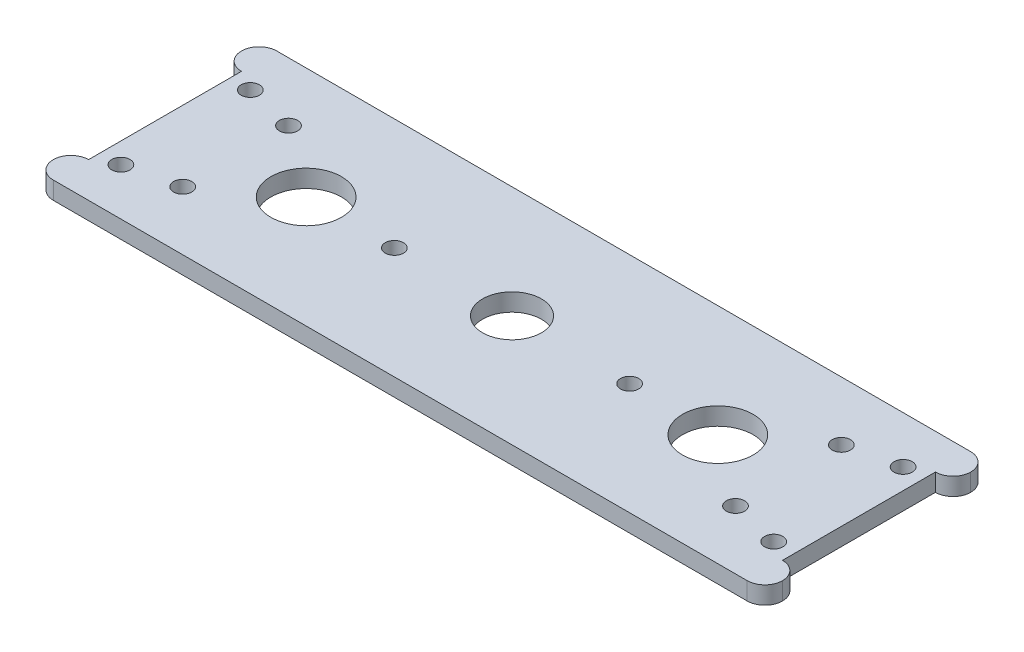
ISO-10303-21;
HEADER;
FILE_DESCRIPTION(('STEP AP214'),'2;1');
FILE_NAME('part.step','',(''),(''),'','','');
FILE_SCHEMA(('AUTOMOTIVE_DESIGN { 1 0 10303 214 1 1 1 1 }'));
ENDSEC;
DATA;
#1=APPLICATION_CONTEXT('core data for automotive mechanical design processes');
#2=APPLICATION_PROTOCOL_DEFINITION('international standard','automotive_design',2000,#1);
#3=PRODUCT_CONTEXT('',#1,'mechanical');
#4=PRODUCT('Part','Part','',(#3));
#5=PRODUCT_RELATED_PRODUCT_CATEGORY('part','',(#4));
#6=PRODUCT_DEFINITION_FORMATION('','',#4);
#7=PRODUCT_DEFINITION_CONTEXT('part definition',#1,'design');
#8=PRODUCT_DEFINITION('design','',#6,#7);
#9=PRODUCT_DEFINITION_SHAPE('','',#8);
#10=(LENGTH_UNIT() NAMED_UNIT(*) SI_UNIT(.MILLI.,.METRE.));
#11=(NAMED_UNIT(*) PLANE_ANGLE_UNIT() SI_UNIT($,.RADIAN.));
#12=(NAMED_UNIT(*) SI_UNIT($,.STERADIAN.) SOLID_ANGLE_UNIT());
#13=UNCERTAINTY_MEASURE_WITH_UNIT(LENGTH_MEASURE(1.E-05),#10,'distance_accuracy_value','');
#14=(GEOMETRIC_REPRESENTATION_CONTEXT(3) GLOBAL_UNCERTAINTY_ASSIGNED_CONTEXT((#13)) GLOBAL_UNIT_ASSIGNED_CONTEXT((#10,
#11,#12)) REPRESENTATION_CONTEXT('',''));
#15=CARTESIAN_POINT('',(0.,0.,0.));
#16=DIRECTION('',(0.,0.,1.));
#17=DIRECTION('',(1.,0.,0.));
#18=AXIS2_PLACEMENT_3D('',#15,#16,#17);
#19=CARTESIAN_POINT('',(0.,3.,0.));
#20=DIRECTION('',(0.,-1.,0.));
#21=DIRECTION('',(0.,0.,-1.));
#22=AXIS2_PLACEMENT_3D('',#19,#20,#21);
#23=PLANE('',#22);
#24=DIRECTION('',(-1.,0.,0.));
#25=VECTOR('',#24,1.);
#26=CARTESIAN_POINT('',(-62.,3.,-19.));
#27=LINE('',#26,#25);
#28=CARTESIAN_POINT('',(59.,3.,-19.));
#29=VERTEX_POINT('',#28);
#30=CARTESIAN_POINT('',(-59.,3.,-19.));
#31=VERTEX_POINT('',#30);
#32=EDGE_CURVE('E145',#29,#31,#27,.T.);
#33=ORIENTED_EDGE('',*,*,#32,.T.);
#34=CARTESIAN_POINT('',(-59.,3.,-16.));
#35=DIRECTION('',(0.,-1.,0.));
#36=DIRECTION('',(0.,0.,-1.));
#37=AXIS2_PLACEMENT_3D('',#34,#35,#36);
#38=CIRCLE('',#37,3.);
#39=CARTESIAN_POINT('',(-62.,3.,-16.));
#40=VERTEX_POINT('',#39);
#41=EDGE_CURVE('E130',#31,#40,#38,.F.);
#42=ORIENTED_EDGE('',*,*,#41,.T.);
#43=CARTESIAN_POINT('',(-59.,3.,-16.));
#44=DIRECTION('',(0.,-1.,0.));
#45=DIRECTION('',(0.,0.,-1.));
#46=AXIS2_PLACEMENT_3D('',#43,#44,#45);
#47=CIRCLE('',#46,3.);
#48=CARTESIAN_POINT('',(-59.,3.,-13.));
#49=VERTEX_POINT('',#48);
#50=EDGE_CURVE('E124',#40,#49,#47,.F.);
#51=ORIENTED_EDGE('',*,*,#50,.T.);
#52=DIRECTION('',(0.,0.,1.));
#53=VECTOR('',#52,1.);
#54=CARTESIAN_POINT('',(-59.,3.,-13.));
#55=LINE('',#54,#53);
#56=CARTESIAN_POINT('',(-59.,3.,13.));
#57=VERTEX_POINT('',#56);
#58=EDGE_CURVE('E128',#49,#57,#55,.T.);
#59=ORIENTED_EDGE('',*,*,#58,.T.);
#60=CARTESIAN_POINT('',(-59.,3.,16.));
#61=DIRECTION('',(0.,-1.,0.));
#62=DIRECTION('',(0.,0.,-1.));
#63=AXIS2_PLACEMENT_3D('',#60,#61,#62);
#64=CIRCLE('',#63,3.);
#65=CARTESIAN_POINT('',(-62.,3.,16.));
#66=VERTEX_POINT('',#65);
#67=EDGE_CURVE('E135',#57,#66,#64,.F.);
#68=ORIENTED_EDGE('',*,*,#67,.T.);
#69=CARTESIAN_POINT('',(-59.,3.,16.));
#70=DIRECTION('',(0.,-1.,0.));
#71=DIRECTION('',(0.,0.,-1.));
#72=AXIS2_PLACEMENT_3D('',#69,#70,#71);
#73=CIRCLE('',#72,3.);
#74=CARTESIAN_POINT('',(-59.,3.,19.));
#75=VERTEX_POINT('',#74);
#76=EDGE_CURVE('E182',#66,#75,#73,.F.);
#77=ORIENTED_EDGE('',*,*,#76,.T.);
#78=DIRECTION('',(1.,0.,0.));
#79=VECTOR('',#78,1.);
#80=CARTESIAN_POINT('',(-62.,3.,19.));
#81=LINE('',#80,#79);
#82=CARTESIAN_POINT('',(59.,3.,19.));
#83=VERTEX_POINT('',#82);
#84=EDGE_CURVE('E144',#75,#83,#81,.T.);
#85=ORIENTED_EDGE('',*,*,#84,.T.);
#86=CARTESIAN_POINT('',(59.,3.,16.));
#87=DIRECTION('',(0.,-1.,0.));
#88=DIRECTION('',(0.,0.,-1.));
#89=AXIS2_PLACEMENT_3D('',#86,#87,#88);
#90=CIRCLE('',#89,3.);
#91=CARTESIAN_POINT('',(62.,3.,16.));
#92=VERTEX_POINT('',#91);
#93=EDGE_CURVE('E52',#83,#92,#90,.F.);
#94=ORIENTED_EDGE('',*,*,#93,.T.);
#95=CARTESIAN_POINT('',(59.,3.,16.));
#96=DIRECTION('',(0.,-1.,0.));
#97=DIRECTION('',(0.,0.,-1.));
#98=AXIS2_PLACEMENT_3D('',#95,#96,#97);
#99=CIRCLE('',#98,3.);
#100=CARTESIAN_POINT('',(59.,3.,13.));
#101=VERTEX_POINT('',#100);
#102=EDGE_CURVE('E179',#92,#101,#99,.F.);
#103=ORIENTED_EDGE('',*,*,#102,.T.);
#104=DIRECTION('',(0.,0.,-1.));
#105=VECTOR('',#104,1.);
#106=CARTESIAN_POINT('',(59.,3.,-13.));
#107=LINE('',#106,#105);
#108=CARTESIAN_POINT('',(59.,3.,-13.));
#109=VERTEX_POINT('',#108);
#110=EDGE_CURVE('E222',#101,#109,#107,.T.);
#111=ORIENTED_EDGE('',*,*,#110,.T.);
#112=CARTESIAN_POINT('',(59.,3.,-16.));
#113=DIRECTION('',(0.,-1.,0.));
#114=DIRECTION('',(0.,0.,-1.));
#115=AXIS2_PLACEMENT_3D('',#112,#113,#114);
#116=CIRCLE('',#115,3.);
#117=CARTESIAN_POINT('',(62.,3.,-16.));
#118=VERTEX_POINT('',#117);
#119=EDGE_CURVE('E177',#109,#118,#116,.F.);
#120=ORIENTED_EDGE('',*,*,#119,.T.);
#121=CARTESIAN_POINT('',(59.,3.,-16.));
#122=DIRECTION('',(0.,-1.,0.));
#123=DIRECTION('',(0.,0.,-1.));
#124=AXIS2_PLACEMENT_3D('',#121,#122,#123);
#125=CIRCLE('',#124,3.);
#126=EDGE_CURVE('E175',#118,#29,#125,.F.);
#127=ORIENTED_EDGE('',*,*,#126,.T.);
#128=EDGE_LOOP('',(#33,#42,#51,#59,#68,#77,#85,#94,#103,#111,#120,#127));
#129=FACE_BOUND('',#128,.T.);
#130=CARTESIAN_POINT('',(0.,3.,0.));
#131=DIRECTION('',(0.,1.,0.));
#132=DIRECTION('',(0.,0.,1.));
#133=AXIS2_PLACEMENT_3D('',#130,#131,#132);
#134=CIRCLE('',#133,5.);
#135=CARTESIAN_POINT('',(0.,3.,5.));
#136=VERTEX_POINT('',#135);
#137=EDGE_CURVE('E228',#136,#136,#134,.T.);
#138=ORIENTED_EDGE('',*,*,#137,.F.);
#139=EDGE_LOOP('',(#138));
#140=FACE_BOUND('',#139,.T.);
#141=CARTESIAN_POINT('',(55.5,3.,-11.));
#142=DIRECTION('',(0.,1.,0.));
#143=DIRECTION('',(0.,0.,1.));
#144=AXIS2_PLACEMENT_3D('',#141,#142,#143);
#145=CIRCLE('',#144,1.54999999999999);
#146=CARTESIAN_POINT('',(55.5,3.,-9.45));
#147=VERTEX_POINT('',#146);
#148=EDGE_CURVE('E350',#147,#147,#145,.T.);
#149=ORIENTED_EDGE('',*,*,#148,.F.);
#150=EDGE_LOOP('',(#149));
#151=FACE_BOUND('',#150,.T.);
#152=CARTESIAN_POINT('',(-55.5,3.,-11.));
#153=DIRECTION('',(0.,1.,0.));
#154=DIRECTION('',(0.,0.,-1.));
#155=AXIS2_PLACEMENT_3D('',#152,#153,#154);
#156=CIRCLE('',#155,1.54999999999999);
#157=CARTESIAN_POINT('',(-55.5,3.,-12.55));
#158=VERTEX_POINT('',#157);
#159=EDGE_CURVE('E355',#158,#158,#156,.T.);
#160=ORIENTED_EDGE('',*,*,#159,.F.);
#161=EDGE_LOOP('',(#160));
#162=FACE_BOUND('',#161,.T.);
#163=CARTESIAN_POINT('',(-55.5,3.,11.));
#164=DIRECTION('',(0.,1.,0.));
#165=DIRECTION('',(0.,0.,1.));
#166=AXIS2_PLACEMENT_3D('',#163,#164,#165);
#167=CIRCLE('',#166,1.54999999999999);
#168=CARTESIAN_POINT('',(-55.5,3.,12.55));
#169=VERTEX_POINT('',#168);
#170=EDGE_CURVE('E434',#169,#169,#167,.T.);
#171=ORIENTED_EDGE('',*,*,#170,.F.);
#172=EDGE_LOOP('',(#171));
#173=FACE_BOUND('',#172,.T.);
#174=CARTESIAN_POINT('',(55.5,3.,11.));
#175=DIRECTION('',(0.,1.,0.));
#176=DIRECTION('',(0.,0.,-1.));
#177=AXIS2_PLACEMENT_3D('',#174,#175,#176);
#178=CIRCLE('',#177,1.54999999999999);
#179=CARTESIAN_POINT('',(55.5,3.,9.45));
#180=VERTEX_POINT('',#179);
#181=EDGE_CURVE('E429',#180,#180,#178,.T.);
#182=ORIENTED_EDGE('',*,*,#181,.F.);
#183=EDGE_LOOP('',(#182));
#184=FACE_BOUND('',#183,.T.);
#185=CARTESIAN_POINT('',(20.,3.,0.));
#186=DIRECTION('',(0.,1.,0.));
#187=DIRECTION('',(0.,0.,1.));
#188=AXIS2_PLACEMENT_3D('',#185,#186,#187);
#189=CIRCLE('',#188,1.55);
#190=CARTESIAN_POINT('',(20.,3.,1.55));
#191=VERTEX_POINT('',#190);
#192=EDGE_CURVE('E424',#191,#191,#189,.T.);
#193=ORIENTED_EDGE('',*,*,#192,.F.);
#194=EDGE_LOOP('',(#193));
#195=FACE_BOUND('',#194,.T.);
#196=CARTESIAN_POINT('',(-20.,3.,0.));
#197=DIRECTION('',(0.,1.,0.));
#198=DIRECTION('',(0.,0.,-1.));
#199=AXIS2_PLACEMENT_3D('',#196,#197,#198);
#200=CIRCLE('',#199,1.55);
#201=CARTESIAN_POINT('',(-20.,3.,-1.55));
#202=VERTEX_POINT('',#201);
#203=EDGE_CURVE('E419',#202,#202,#200,.T.);
#204=ORIENTED_EDGE('',*,*,#203,.F.);
#205=EDGE_LOOP('',(#204));
#206=FACE_BOUND('',#205,.T.);
#207=CARTESIAN_POINT('',(35.,3.,0.));
#208=DIRECTION('',(0.,1.,0.));
#209=DIRECTION('',(0.,0.,1.));
#210=AXIS2_PLACEMENT_3D('',#207,#208,#209);
#211=CIRCLE('',#210,6.);
#212=CARTESIAN_POINT('',(35.,3.,6.));
#213=VERTEX_POINT('',#212);
#214=EDGE_CURVE('E414',#213,#213,#211,.T.);
#215=ORIENTED_EDGE('',*,*,#214,.F.);
#216=EDGE_LOOP('',(#215));
#217=FACE_BOUND('',#216,.T.);
#218=CARTESIAN_POINT('',(-35.,3.,0.));
#219=DIRECTION('',(0.,1.,0.));
#220=DIRECTION('',(0.,0.,-1.));
#221=AXIS2_PLACEMENT_3D('',#218,#219,#220);
#222=CIRCLE('',#221,6.);
#223=CARTESIAN_POINT('',(-35.,3.,-6.));
#224=VERTEX_POINT('',#223);
#225=EDGE_CURVE('E409',#224,#224,#222,.T.);
#226=ORIENTED_EDGE('',*,*,#225,.F.);
#227=EDGE_LOOP('',(#226));
#228=FACE_BOUND('',#227,.T.);
#229=CARTESIAN_POINT('',(47.,3.,-9.));
#230=DIRECTION('',(0.,1.,0.));
#231=DIRECTION('',(0.,0.,1.));
#232=AXIS2_PLACEMENT_3D('',#229,#230,#231);
#233=CIRCLE('',#232,1.55);
#234=CARTESIAN_POINT('',(47.,3.,-7.45));
#235=VERTEX_POINT('',#234);
#236=EDGE_CURVE('E404',#235,#235,#233,.T.);
#237=ORIENTED_EDGE('',*,*,#236,.F.);
#238=EDGE_LOOP('',(#237));
#239=FACE_BOUND('',#238,.T.);
#240=CARTESIAN_POINT('',(47.,3.,9.));
#241=DIRECTION('',(0.,1.,0.));
#242=DIRECTION('',(0.,0.,-1.));
#243=AXIS2_PLACEMENT_3D('',#240,#241,#242);
#244=CIRCLE('',#243,1.55);
#245=CARTESIAN_POINT('',(47.,3.,7.45));
#246=VERTEX_POINT('',#245);
#247=EDGE_CURVE('E399',#246,#246,#244,.T.);
#248=ORIENTED_EDGE('',*,*,#247,.F.);
#249=EDGE_LOOP('',(#248));
#250=FACE_BOUND('',#249,.T.);
#251=CARTESIAN_POINT('',(-47.,3.,9.));
#252=DIRECTION('',(0.,1.,0.));
#253=DIRECTION('',(0.,0.,1.));
#254=AXIS2_PLACEMENT_3D('',#251,#252,#253);
#255=CIRCLE('',#254,1.55);
#256=CARTESIAN_POINT('',(-47.,3.,10.55));
#257=VERTEX_POINT('',#256);
#258=EDGE_CURVE('E394',#257,#257,#255,.T.);
#259=ORIENTED_EDGE('',*,*,#258,.F.);
#260=EDGE_LOOP('',(#259));
#261=FACE_BOUND('',#260,.T.);
#262=CARTESIAN_POINT('',(-47.,3.,-9.));
#263=DIRECTION('',(0.,1.,0.));
#264=DIRECTION('',(0.,0.,-1.));
#265=AXIS2_PLACEMENT_3D('',#262,#263,#264);
#266=CIRCLE('',#265,1.55);
#267=CARTESIAN_POINT('',(-47.,3.,-10.55));
#268=VERTEX_POINT('',#267);
#269=EDGE_CURVE('E389',#268,#268,#266,.T.);
#270=ORIENTED_EDGE('',*,*,#269,.F.);
#271=EDGE_LOOP('',(#270));
#272=FACE_BOUND('',#271,.T.);
#273=ADVANCED_FACE('F35',(#129,#140,#151,#162,#173,#184,#195,#206,#217,#228,#239,#250,#261,
#272),#23,.F.);
#274=CARTESIAN_POINT('',(0.,0.,0.));
#275=DIRECTION('',(0.,-1.,0.));
#276=DIRECTION('',(0.,0.,-1.));
#277=AXIS2_PLACEMENT_3D('',#274,#275,#276);
#278=PLANE('',#277);
#279=CARTESIAN_POINT('',(-47.,0.,9.));
#280=DIRECTION('',(0.,1.,0.));
#281=DIRECTION('',(0.,0.,1.));
#282=AXIS2_PLACEMENT_3D('',#279,#280,#281);
#283=CIRCLE('',#282,1.55);
#284=CARTESIAN_POINT('',(-47.,0.,10.55));
#285=VERTEX_POINT('',#284);
#286=EDGE_CURVE('E391',#285,#285,#283,.T.);
#287=ORIENTED_EDGE('',*,*,#286,.T.);
#288=EDGE_LOOP('',(#287));
#289=FACE_BOUND('',#288,.T.);
#290=CARTESIAN_POINT('',(47.,0.,-9.));
#291=DIRECTION('',(0.,1.,0.));
#292=DIRECTION('',(0.,0.,1.));
#293=AXIS2_PLACEMENT_3D('',#290,#291,#292);
#294=CIRCLE('',#293,1.55);
#295=CARTESIAN_POINT('',(47.,0.,-7.45));
#296=VERTEX_POINT('',#295);
#297=EDGE_CURVE('E402',#296,#296,#294,.T.);
#298=ORIENTED_EDGE('',*,*,#297,.T.);
#299=EDGE_LOOP('',(#298));
#300=FACE_BOUND('',#299,.T.);
#301=CARTESIAN_POINT('',(35.,0.,0.));
#302=DIRECTION('',(0.,1.,0.));
#303=DIRECTION('',(0.,0.,1.));
#304=AXIS2_PLACEMENT_3D('',#301,#302,#303);
#305=CIRCLE('',#304,6.);
#306=CARTESIAN_POINT('',(35.,0.,6.));
#307=VERTEX_POINT('',#306);
#308=EDGE_CURVE('E412',#307,#307,#305,.T.);
#309=ORIENTED_EDGE('',*,*,#308,.T.);
#310=EDGE_LOOP('',(#309));
#311=FACE_BOUND('',#310,.T.);
#312=CARTESIAN_POINT('',(20.,0.,0.));
#313=DIRECTION('',(0.,1.,0.));
#314=DIRECTION('',(0.,0.,1.));
#315=AXIS2_PLACEMENT_3D('',#312,#313,#314);
#316=CIRCLE('',#315,1.55);
#317=CARTESIAN_POINT('',(20.,0.,1.55));
#318=VERTEX_POINT('',#317);
#319=EDGE_CURVE('E422',#318,#318,#316,.T.);
#320=ORIENTED_EDGE('',*,*,#319,.T.);
#321=EDGE_LOOP('',(#320));
#322=FACE_BOUND('',#321,.T.);
#323=CARTESIAN_POINT('',(-55.5,0.,11.));
#324=DIRECTION('',(0.,1.,0.));
#325=DIRECTION('',(0.,0.,1.));
#326=AXIS2_PLACEMENT_3D('',#323,#324,#325);
#327=CIRCLE('',#326,1.54999999999999);
#328=CARTESIAN_POINT('',(-55.5,0.,12.55));
#329=VERTEX_POINT('',#328);
#330=EDGE_CURVE('E432',#329,#329,#327,.T.);
#331=ORIENTED_EDGE('',*,*,#330,.T.);
#332=EDGE_LOOP('',(#331));
#333=FACE_BOUND('',#332,.T.);
#334=CARTESIAN_POINT('',(55.5,0.,-11.));
#335=DIRECTION('',(0.,1.,0.));
#336=DIRECTION('',(0.,0.,1.));
#337=AXIS2_PLACEMENT_3D('',#334,#335,#336);
#338=CIRCLE('',#337,1.54999999999999);
#339=CARTESIAN_POINT('',(55.5,0.,-9.45));
#340=VERTEX_POINT('',#339);
#341=EDGE_CURVE('E353',#340,#340,#338,.T.);
#342=ORIENTED_EDGE('',*,*,#341,.T.);
#343=EDGE_LOOP('',(#342));
#344=FACE_BOUND('',#343,.T.);
#345=CARTESIAN_POINT('',(-59.,0.,-16.));
#346=DIRECTION('',(0.,-1.,0.));
#347=DIRECTION('',(0.,0.,-1.));
#348=AXIS2_PLACEMENT_3D('',#345,#346,#347);
#349=CIRCLE('',#348,3.);
#350=CARTESIAN_POINT('',(-59.,0.,-13.));
#351=VERTEX_POINT('',#350);
#352=CARTESIAN_POINT('',(-62.,0.,-16.));
#353=VERTEX_POINT('',#352);
#354=EDGE_CURVE('E149',#351,#353,#349,.T.);
#355=ORIENTED_EDGE('',*,*,#354,.T.);
#356=CARTESIAN_POINT('',(-59.,0.,-16.));
#357=DIRECTION('',(0.,-1.,0.));
#358=DIRECTION('',(0.,0.,-1.));
#359=AXIS2_PLACEMENT_3D('',#356,#357,#358);
#360=CIRCLE('',#359,3.);
#361=CARTESIAN_POINT('',(-59.,0.,-19.));
#362=VERTEX_POINT('',#361);
#363=EDGE_CURVE('E168',#353,#362,#360,.T.);
#364=ORIENTED_EDGE('',*,*,#363,.T.);
#365=DIRECTION('',(-1.,0.,0.));
#366=VECTOR('',#365,1.);
#367=CARTESIAN_POINT('',(-62.,0.,-19.));
#368=LINE('',#367,#366);
#369=CARTESIAN_POINT('',(59.,0.,-19.));
#370=VERTEX_POINT('',#369);
#371=EDGE_CURVE('E225',#370,#362,#368,.T.);
#372=ORIENTED_EDGE('',*,*,#371,.F.);
#373=CARTESIAN_POINT('',(59.,0.,-16.));
#374=DIRECTION('',(0.,-1.,0.));
#375=DIRECTION('',(0.,0.,-1.));
#376=AXIS2_PLACEMENT_3D('',#373,#374,#375);
#377=CIRCLE('',#376,3.);
#378=CARTESIAN_POINT('',(62.,0.,-16.));
#379=VERTEX_POINT('',#378);
#380=EDGE_CURVE('E150',#370,#379,#377,.T.);
#381=ORIENTED_EDGE('',*,*,#380,.T.);
#382=CARTESIAN_POINT('',(59.,0.,-16.));
#383=DIRECTION('',(0.,-1.,0.));
#384=DIRECTION('',(0.,0.,-1.));
#385=AXIS2_PLACEMENT_3D('',#382,#383,#384);
#386=CIRCLE('',#385,3.);
#387=CARTESIAN_POINT('',(59.,0.,-13.));
#388=VERTEX_POINT('',#387);
#389=EDGE_CURVE('E152',#379,#388,#386,.T.);
#390=ORIENTED_EDGE('',*,*,#389,.T.);
#391=DIRECTION('',(0.,0.,-1.));
#392=VECTOR('',#391,1.);
#393=CARTESIAN_POINT('',(59.,0.,-13.));
#394=LINE('',#393,#392);
#395=CARTESIAN_POINT('',(59.,0.,13.));
#396=VERTEX_POINT('',#395);
#397=EDGE_CURVE('E212',#396,#388,#394,.T.);
#398=ORIENTED_EDGE('',*,*,#397,.F.);
#399=CARTESIAN_POINT('',(59.,0.,16.));
#400=DIRECTION('',(0.,-1.,0.));
#401=DIRECTION('',(0.,0.,-1.));
#402=AXIS2_PLACEMENT_3D('',#399,#400,#401);
#403=CIRCLE('',#402,3.);
#404=CARTESIAN_POINT('',(62.,0.,16.));
#405=VERTEX_POINT('',#404);
#406=EDGE_CURVE('E159',#396,#405,#403,.T.);
#407=ORIENTED_EDGE('',*,*,#406,.T.);
#408=CARTESIAN_POINT('',(59.,0.,16.));
#409=DIRECTION('',(0.,-1.,0.));
#410=DIRECTION('',(0.,0.,-1.));
#411=AXIS2_PLACEMENT_3D('',#408,#409,#410);
#412=CIRCLE('',#411,3.);
#413=CARTESIAN_POINT('',(59.,0.,19.));
#414=VERTEX_POINT('',#413);
#415=EDGE_CURVE('E161',#405,#414,#412,.T.);
#416=ORIENTED_EDGE('',*,*,#415,.T.);
#417=DIRECTION('',(1.,0.,0.));
#418=VECTOR('',#417,1.);
#419=CARTESIAN_POINT('',(-62.,0.,19.));
#420=LINE('',#419,#418);
#421=CARTESIAN_POINT('',(-59.,0.,19.));
#422=VERTEX_POINT('',#421);
#423=EDGE_CURVE('E215',#422,#414,#420,.T.);
#424=ORIENTED_EDGE('',*,*,#423,.F.);
#425=CARTESIAN_POINT('',(-59.,0.,16.));
#426=DIRECTION('',(0.,-1.,0.));
#427=DIRECTION('',(0.,0.,-1.));
#428=AXIS2_PLACEMENT_3D('',#425,#426,#427);
#429=CIRCLE('',#428,3.);
#430=CARTESIAN_POINT('',(-62.,0.,16.));
#431=VERTEX_POINT('',#430);
#432=EDGE_CURVE('E163',#422,#431,#429,.T.);
#433=ORIENTED_EDGE('',*,*,#432,.T.);
#434=CARTESIAN_POINT('',(-59.,0.,16.));
#435=DIRECTION('',(0.,-1.,0.));
#436=DIRECTION('',(0.,0.,-1.));
#437=AXIS2_PLACEMENT_3D('',#434,#435,#436);
#438=CIRCLE('',#437,3.);
#439=CARTESIAN_POINT('',(-59.,0.,13.));
#440=VERTEX_POINT('',#439);
#441=EDGE_CURVE('E165',#431,#440,#438,.T.);
#442=ORIENTED_EDGE('',*,*,#441,.T.);
#443=DIRECTION('',(0.,0.,1.));
#444=VECTOR('',#443,1.);
#445=CARTESIAN_POINT('',(-59.,0.,-13.));
#446=LINE('',#445,#444);
#447=EDGE_CURVE('E227',#351,#440,#446,.T.);
#448=ORIENTED_EDGE('',*,*,#447,.F.);
#449=EDGE_LOOP('',(#355,#364,#372,#381,#390,#398,#407,#416,#424,#433,#442,#448));
#450=FACE_BOUND('',#449,.T.);
#451=CARTESIAN_POINT('',(0.,0.,0.));
#452=DIRECTION('',(0.,1.,0.));
#453=DIRECTION('',(0.,0.,1.));
#454=AXIS2_PLACEMENT_3D('',#451,#452,#453);
#455=CIRCLE('',#454,5.);
#456=CARTESIAN_POINT('',(0.,0.,5.));
#457=VERTEX_POINT('',#456);
#458=EDGE_CURVE('E218',#457,#457,#455,.T.);
#459=ORIENTED_EDGE('',*,*,#458,.T.);
#460=EDGE_LOOP('',(#459));
#461=FACE_BOUND('',#460,.T.);
#462=CARTESIAN_POINT('',(-55.5,0.,-11.));
#463=DIRECTION('',(0.,1.,0.));
#464=DIRECTION('',(0.,0.,-1.));
#465=AXIS2_PLACEMENT_3D('',#462,#463,#464);
#466=CIRCLE('',#465,1.54999999999999);
#467=CARTESIAN_POINT('',(-55.5,0.,-12.55));
#468=VERTEX_POINT('',#467);
#469=EDGE_CURVE('E359',#468,#468,#466,.T.);
#470=ORIENTED_EDGE('',*,*,#469,.T.);
#471=EDGE_LOOP('',(#470));
#472=FACE_BOUND('',#471,.T.);
#473=CARTESIAN_POINT('',(55.5,0.,11.));
#474=DIRECTION('',(0.,1.,0.));
#475=DIRECTION('',(0.,0.,-1.));
#476=AXIS2_PLACEMENT_3D('',#473,#474,#475);
#477=CIRCLE('',#476,1.54999999999999);
#478=CARTESIAN_POINT('',(55.5,0.,9.45));
#479=VERTEX_POINT('',#478);
#480=EDGE_CURVE('E374',#479,#479,#477,.T.);
#481=ORIENTED_EDGE('',*,*,#480,.T.);
#482=EDGE_LOOP('',(#481));
#483=FACE_BOUND('',#482,.T.);
#484=CARTESIAN_POINT('',(-20.,0.,0.));
#485=DIRECTION('',(0.,1.,0.));
#486=DIRECTION('',(0.,0.,-1.));
#487=AXIS2_PLACEMENT_3D('',#484,#485,#486);
#488=CIRCLE('',#487,1.55);
#489=CARTESIAN_POINT('',(-20.,0.,-1.55));
#490=VERTEX_POINT('',#489);
#491=EDGE_CURVE('E378',#490,#490,#488,.T.);
#492=ORIENTED_EDGE('',*,*,#491,.T.);
#493=EDGE_LOOP('',(#492));
#494=FACE_BOUND('',#493,.T.);
#495=CARTESIAN_POINT('',(-35.,0.,0.));
#496=DIRECTION('',(0.,1.,0.));
#497=DIRECTION('',(0.,0.,-1.));
#498=AXIS2_PLACEMENT_3D('',#495,#496,#497);
#499=CIRCLE('',#498,6.);
#500=CARTESIAN_POINT('',(-35.,0.,-6.));
#501=VERTEX_POINT('',#500);
#502=EDGE_CURVE('E382',#501,#501,#499,.T.);
#503=ORIENTED_EDGE('',*,*,#502,.T.);
#504=EDGE_LOOP('',(#503));
#505=FACE_BOUND('',#504,.T.);
#506=CARTESIAN_POINT('',(47.,0.,9.));
#507=DIRECTION('',(0.,1.,0.));
#508=DIRECTION('',(0.,0.,-1.));
#509=AXIS2_PLACEMENT_3D('',#506,#507,#508);
#510=CIRCLE('',#509,1.55);
#511=CARTESIAN_POINT('',(47.,0.,7.45));
#512=VERTEX_POINT('',#511);
#513=EDGE_CURVE('E386',#512,#512,#510,.T.);
#514=ORIENTED_EDGE('',*,*,#513,.T.);
#515=EDGE_LOOP('',(#514));
#516=FACE_BOUND('',#515,.T.);
#517=CARTESIAN_POINT('',(-47.,0.,-9.));
#518=DIRECTION('',(0.,1.,0.));
#519=DIRECTION('',(0.,0.,-1.));
#520=AXIS2_PLACEMENT_3D('',#517,#518,#519);
#521=CIRCLE('',#520,1.55);
#522=CARTESIAN_POINT('',(-47.,0.,-10.55));
#523=VERTEX_POINT('',#522);
#524=EDGE_CURVE('E189',#523,#523,#521,.T.);
#525=ORIENTED_EDGE('',*,*,#524,.T.);
#526=EDGE_LOOP('',(#525));
#527=FACE_BOUND('',#526,.T.);
#528=ADVANCED_FACE('F241',(#289,#300,#311,#322,#333,#344,#450,#461,#472,#483,#494,#505,#516,
#527),#278,.T.);
#529=CARTESIAN_POINT('',(-62.,3.,-19.));
#530=DIRECTION('',(0.,0.,1.));
#531=DIRECTION('',(1.,0.,0.));
#532=AXIS2_PLACEMENT_3D('',#529,#530,#531);
#533=PLANE('',#532);
#534=ORIENTED_EDGE('',*,*,#371,.T.);
#535=DIRECTION('',(0.,-1.,0.));
#536=VECTOR('',#535,1.);
#537=CARTESIAN_POINT('',(-59.,3.,-19.));
#538=LINE('',#537,#536);
#539=EDGE_CURVE('E172',#362,#31,#538,.F.);
#540=ORIENTED_EDGE('',*,*,#539,.T.);
#541=ORIENTED_EDGE('',*,*,#32,.F.);
#542=DIRECTION('',(0.,-1.,0.));
#543=VECTOR('',#542,1.);
#544=CARTESIAN_POINT('',(59.,3.,-19.));
#545=LINE('',#544,#543);
#546=EDGE_CURVE('E170',#29,#370,#545,.T.);
#547=ORIENTED_EDGE('',*,*,#546,.T.);
#548=EDGE_LOOP('',(#534,#540,#541,#547));
#549=FACE_BOUND('',#548,.T.);
#550=ADVANCED_FACE('F209',(#549),#533,.F.);
#551=CARTESIAN_POINT('',(-59.,3.,-13.));
#552=DIRECTION('',(1.,0.,0.));
#553=DIRECTION('',(0.,0.,-1.));
#554=AXIS2_PLACEMENT_3D('',#551,#552,#553);
#555=PLANE('',#554);
#556=ORIENTED_EDGE('',*,*,#447,.T.);
#557=DIRECTION('',(0.,-1.,0.));
#558=VECTOR('',#557,1.);
#559=CARTESIAN_POINT('',(-59.,3.,13.));
#560=LINE('',#559,#558);
#561=EDGE_CURVE('E143',#57,#440,#560,.T.);
#562=ORIENTED_EDGE('',*,*,#561,.F.);
#563=ORIENTED_EDGE('',*,*,#58,.F.);
#564=DIRECTION('',(0.,-1.,0.));
#565=VECTOR('',#564,1.);
#566=CARTESIAN_POINT('',(-59.,3.,-13.));
#567=LINE('',#566,#565);
#568=EDGE_CURVE('E140',#49,#351,#567,.T.);
#569=ORIENTED_EDGE('',*,*,#568,.T.);
#570=EDGE_LOOP('',(#556,#562,#563,#569));
#571=FACE_BOUND('',#570,.T.);
#572=ADVANCED_FACE('F139',(#571),#555,.F.);
#573=CARTESIAN_POINT('',(-62.,3.,19.));
#574=DIRECTION('',(0.,0.,-1.));
#575=DIRECTION('',(-1.,0.,0.));
#576=AXIS2_PLACEMENT_3D('',#573,#574,#575);
#577=PLANE('',#576);
#578=ORIENTED_EDGE('',*,*,#84,.F.);
#579=DIRECTION('',(0.,-1.,0.));
#580=VECTOR('',#579,1.);
#581=CARTESIAN_POINT('',(-59.,3.,19.));
#582=LINE('',#581,#580);
#583=EDGE_CURVE('E11',#75,#422,#582,.T.);
#584=ORIENTED_EDGE('',*,*,#583,.T.);
#585=ORIENTED_EDGE('',*,*,#423,.T.);
#586=DIRECTION('',(0.,-1.,0.));
#587=VECTOR('',#586,1.);
#588=CARTESIAN_POINT('',(59.,3.,19.));
#589=LINE('',#588,#587);
#590=EDGE_CURVE('E44',#414,#83,#589,.F.);
#591=ORIENTED_EDGE('',*,*,#590,.T.);
#592=EDGE_LOOP('',(#578,#584,#585,#591));
#593=FACE_BOUND('',#592,.T.);
#594=ADVANCED_FACE('F249',(#593),#577,.F.);
#595=CARTESIAN_POINT('',(59.,3.,-13.));
#596=DIRECTION('',(-1.,0.,0.));
#597=DIRECTION('',(0.,0.,1.));
#598=AXIS2_PLACEMENT_3D('',#595,#596,#597);
#599=PLANE('',#598);
#600=ORIENTED_EDGE('',*,*,#397,.T.);
#601=DIRECTION('',(0.,-1.,0.));
#602=VECTOR('',#601,1.);
#603=CARTESIAN_POINT('',(59.,3.,-13.));
#604=LINE('',#603,#602);
#605=EDGE_CURVE('E224',#109,#388,#604,.T.);
#606=ORIENTED_EDGE('',*,*,#605,.F.);
#607=ORIENTED_EDGE('',*,*,#110,.F.);
#608=DIRECTION('',(0.,-1.,0.));
#609=VECTOR('',#608,1.);
#610=CARTESIAN_POINT('',(59.,3.,13.));
#611=LINE('',#610,#609);
#612=EDGE_CURVE('E154',#101,#396,#611,.T.);
#613=ORIENTED_EDGE('',*,*,#612,.T.);
#614=EDGE_LOOP('',(#600,#606,#607,#613));
#615=FACE_BOUND('',#614,.T.);
#616=ADVANCED_FACE('F236',(#615),#599,.F.);
#617=CARTESIAN_POINT('',(0.,3.,0.));
#618=DIRECTION('',(0.,-1.,0.));
#619=DIRECTION('',(0.,0.,-1.));
#620=AXIS2_PLACEMENT_3D('',#617,#618,#619);
#621=CYLINDRICAL_SURFACE('',#620,5.);
#622=ORIENTED_EDGE('',*,*,#137,.T.);
#623=EDGE_LOOP('',(#622));
#624=FACE_BOUND('',#623,.T.);
#625=ORIENTED_EDGE('',*,*,#458,.F.);
#626=EDGE_LOOP('',(#625));
#627=FACE_BOUND('',#626,.T.);
#628=ADVANCED_FACE('F276',(#624,#627),#621,.F.);
#629=CARTESIAN_POINT('',(55.5,3.,-11.));
#630=DIRECTION('',(0.,-1.,0.));
#631=DIRECTION('',(0.,0.,-1.));
#632=AXIS2_PLACEMENT_3D('',#629,#630,#631);
#633=CYLINDRICAL_SURFACE('',#632,1.54999999999999);
#634=ORIENTED_EDGE('',*,*,#148,.T.);
#635=EDGE_LOOP('',(#634));
#636=FACE_BOUND('',#635,.T.);
#637=ORIENTED_EDGE('',*,*,#341,.F.);
#638=EDGE_LOOP('',(#637));
#639=FACE_BOUND('',#638,.T.);
#640=ADVANCED_FACE('F339',(#636,#639),#633,.F.);
#641=CARTESIAN_POINT('',(-55.5,3.,-11.));
#642=DIRECTION('',(0.,-1.,0.));
#643=DIRECTION('',(0.,0.,-1.));
#644=AXIS2_PLACEMENT_3D('',#641,#642,#643);
#645=CYLINDRICAL_SURFACE('',#644,1.54999999999999);
#646=ORIENTED_EDGE('',*,*,#159,.T.);
#647=EDGE_LOOP('',(#646));
#648=FACE_BOUND('',#647,.T.);
#649=ORIENTED_EDGE('',*,*,#469,.F.);
#650=EDGE_LOOP('',(#649));
#651=FACE_BOUND('',#650,.T.);
#652=ADVANCED_FACE('F336',(#648,#651),#645,.F.);
#653=CARTESIAN_POINT('',(-55.5,3.,11.));
#654=DIRECTION('',(0.,-1.,0.));
#655=DIRECTION('',(0.,0.,-1.));
#656=AXIS2_PLACEMENT_3D('',#653,#654,#655);
#657=CYLINDRICAL_SURFACE('',#656,1.54999999999999);
#658=ORIENTED_EDGE('',*,*,#170,.T.);
#659=EDGE_LOOP('',(#658));
#660=FACE_BOUND('',#659,.T.);
#661=ORIENTED_EDGE('',*,*,#330,.F.);
#662=EDGE_LOOP('',(#661));
#663=FACE_BOUND('',#662,.T.);
#664=ADVANCED_FACE('F332',(#660,#663),#657,.F.);
#665=CARTESIAN_POINT('',(55.5,3.,11.));
#666=DIRECTION('',(0.,-1.,0.));
#667=DIRECTION('',(0.,0.,-1.));
#668=AXIS2_PLACEMENT_3D('',#665,#666,#667);
#669=CYLINDRICAL_SURFACE('',#668,1.54999999999999);
#670=ORIENTED_EDGE('',*,*,#181,.T.);
#671=EDGE_LOOP('',(#670));
#672=FACE_BOUND('',#671,.T.);
#673=ORIENTED_EDGE('',*,*,#480,.F.);
#674=EDGE_LOOP('',(#673));
#675=FACE_BOUND('',#674,.T.);
#676=ADVANCED_FACE('F328',(#672,#675),#669,.F.);
#677=CARTESIAN_POINT('',(20.,3.,0.));
#678=DIRECTION('',(0.,-1.,0.));
#679=DIRECTION('',(0.,0.,-1.));
#680=AXIS2_PLACEMENT_3D('',#677,#678,#679);
#681=CYLINDRICAL_SURFACE('',#680,1.55);
#682=ORIENTED_EDGE('',*,*,#192,.T.);
#683=EDGE_LOOP('',(#682));
#684=FACE_BOUND('',#683,.T.);
#685=ORIENTED_EDGE('',*,*,#319,.F.);
#686=EDGE_LOOP('',(#685));
#687=FACE_BOUND('',#686,.T.);
#688=ADVANCED_FACE('F324',(#684,#687),#681,.F.);
#689=CARTESIAN_POINT('',(-20.,3.,0.));
#690=DIRECTION('',(0.,-1.,0.));
#691=DIRECTION('',(0.,0.,-1.));
#692=AXIS2_PLACEMENT_3D('',#689,#690,#691);
#693=CYLINDRICAL_SURFACE('',#692,1.55);
#694=ORIENTED_EDGE('',*,*,#203,.T.);
#695=EDGE_LOOP('',(#694));
#696=FACE_BOUND('',#695,.T.);
#697=ORIENTED_EDGE('',*,*,#491,.F.);
#698=EDGE_LOOP('',(#697));
#699=FACE_BOUND('',#698,.T.);
#700=ADVANCED_FACE('F320',(#696,#699),#693,.F.);
#701=CARTESIAN_POINT('',(35.,3.,0.));
#702=DIRECTION('',(0.,-1.,0.));
#703=DIRECTION('',(0.,0.,-1.));
#704=AXIS2_PLACEMENT_3D('',#701,#702,#703);
#705=CYLINDRICAL_SURFACE('',#704,6.);
#706=ORIENTED_EDGE('',*,*,#214,.T.);
#707=EDGE_LOOP('',(#706));
#708=FACE_BOUND('',#707,.T.);
#709=ORIENTED_EDGE('',*,*,#308,.F.);
#710=EDGE_LOOP('',(#709));
#711=FACE_BOUND('',#710,.T.);
#712=ADVANCED_FACE('F316',(#708,#711),#705,.F.);
#713=CARTESIAN_POINT('',(-35.,3.,0.));
#714=DIRECTION('',(0.,-1.,0.));
#715=DIRECTION('',(0.,0.,-1.));
#716=AXIS2_PLACEMENT_3D('',#713,#714,#715);
#717=CYLINDRICAL_SURFACE('',#716,6.);
#718=ORIENTED_EDGE('',*,*,#225,.T.);
#719=EDGE_LOOP('',(#718));
#720=FACE_BOUND('',#719,.T.);
#721=ORIENTED_EDGE('',*,*,#502,.F.);
#722=EDGE_LOOP('',(#721));
#723=FACE_BOUND('',#722,.T.);
#724=ADVANCED_FACE('F312',(#720,#723),#717,.F.);
#725=CARTESIAN_POINT('',(47.,3.,-9.));
#726=DIRECTION('',(0.,-1.,0.));
#727=DIRECTION('',(0.,0.,-1.));
#728=AXIS2_PLACEMENT_3D('',#725,#726,#727);
#729=CYLINDRICAL_SURFACE('',#728,1.55);
#730=ORIENTED_EDGE('',*,*,#236,.T.);
#731=EDGE_LOOP('',(#730));
#732=FACE_BOUND('',#731,.T.);
#733=ORIENTED_EDGE('',*,*,#297,.F.);
#734=EDGE_LOOP('',(#733));
#735=FACE_BOUND('',#734,.T.);
#736=ADVANCED_FACE('F308',(#732,#735),#729,.F.);
#737=CARTESIAN_POINT('',(47.,3.,9.));
#738=DIRECTION('',(0.,-1.,0.));
#739=DIRECTION('',(0.,0.,-1.));
#740=AXIS2_PLACEMENT_3D('',#737,#738,#739);
#741=CYLINDRICAL_SURFACE('',#740,1.55);
#742=ORIENTED_EDGE('',*,*,#247,.T.);
#743=EDGE_LOOP('',(#742));
#744=FACE_BOUND('',#743,.T.);
#745=ORIENTED_EDGE('',*,*,#513,.F.);
#746=EDGE_LOOP('',(#745));
#747=FACE_BOUND('',#746,.T.);
#748=ADVANCED_FACE('F300',(#744,#747),#741,.F.);
#749=CARTESIAN_POINT('',(-47.,3.,9.));
#750=DIRECTION('',(0.,-1.,0.));
#751=DIRECTION('',(0.,0.,-1.));
#752=AXIS2_PLACEMENT_3D('',#749,#750,#751);
#753=CYLINDRICAL_SURFACE('',#752,1.55);
#754=ORIENTED_EDGE('',*,*,#258,.T.);
#755=EDGE_LOOP('',(#754));
#756=FACE_BOUND('',#755,.T.);
#757=ORIENTED_EDGE('',*,*,#286,.F.);
#758=EDGE_LOOP('',(#757));
#759=FACE_BOUND('',#758,.T.);
#760=ADVANCED_FACE('F294',(#756,#759),#753,.F.);
#761=CARTESIAN_POINT('',(-47.,3.,-9.));
#762=DIRECTION('',(0.,-1.,0.));
#763=DIRECTION('',(0.,0.,-1.));
#764=AXIS2_PLACEMENT_3D('',#761,#762,#763);
#765=CYLINDRICAL_SURFACE('',#764,1.55);
#766=ORIENTED_EDGE('',*,*,#269,.T.);
#767=EDGE_LOOP('',(#766));
#768=FACE_BOUND('',#767,.T.);
#769=ORIENTED_EDGE('',*,*,#524,.F.);
#770=EDGE_LOOP('',(#769));
#771=FACE_BOUND('',#770,.T.);
#772=ADVANCED_FACE('F290',(#768,#771),#765,.F.);
#773=CARTESIAN_POINT('',(-59.,3.,-16.));
#774=DIRECTION('',(0.,-1.,0.));
#775=DIRECTION('',(0.,0.,-1.));
#776=AXIS2_PLACEMENT_3D('',#773,#774,#775);
#777=CYLINDRICAL_SURFACE('',#776,3.);
#778=ORIENTED_EDGE('',*,*,#568,.F.);
#779=ORIENTED_EDGE('',*,*,#50,.F.);
#780=DIRECTION('',(0.,-1.,0.));
#781=VECTOR('',#780,1.);
#782=CARTESIAN_POINT('',(-62.,3.,-16.));
#783=LINE('',#782,#781);
#784=EDGE_CURVE('E187',#353,#40,#783,.F.);
#785=ORIENTED_EDGE('',*,*,#784,.F.);
#786=ORIENTED_EDGE('',*,*,#354,.F.);
#787=EDGE_LOOP('',(#778,#779,#785,#786));
#788=FACE_BOUND('',#787,.T.);
#789=ADVANCED_FACE('F148',(#788),#777,.T.);
#790=CARTESIAN_POINT('',(-59.,3.,-16.));
#791=DIRECTION('',(0.,-1.,0.));
#792=DIRECTION('',(0.,0.,-1.));
#793=AXIS2_PLACEMENT_3D('',#790,#791,#792);
#794=CYLINDRICAL_SURFACE('',#793,3.);
#795=ORIENTED_EDGE('',*,*,#41,.F.);
#796=ORIENTED_EDGE('',*,*,#539,.F.);
#797=ORIENTED_EDGE('',*,*,#363,.F.);
#798=ORIENTED_EDGE('',*,*,#784,.T.);
#799=EDGE_LOOP('',(#795,#796,#797,#798));
#800=FACE_BOUND('',#799,.T.);
#801=ADVANCED_FACE('F265',(#800),#794,.T.);
#802=CARTESIAN_POINT('',(-59.,3.,16.));
#803=DIRECTION('',(0.,-1.,0.));
#804=DIRECTION('',(0.,0.,-1.));
#805=AXIS2_PLACEMENT_3D('',#802,#803,#804);
#806=CYLINDRICAL_SURFACE('',#805,3.);
#807=ORIENTED_EDGE('',*,*,#583,.F.);
#808=ORIENTED_EDGE('',*,*,#76,.F.);
#809=DIRECTION('',(0.,-1.,0.));
#810=VECTOR('',#809,1.);
#811=CARTESIAN_POINT('',(-62.,3.,16.));
#812=LINE('',#811,#810);
#813=EDGE_CURVE('E190',#431,#66,#812,.F.);
#814=ORIENTED_EDGE('',*,*,#813,.F.);
#815=ORIENTED_EDGE('',*,*,#432,.F.);
#816=EDGE_LOOP('',(#807,#808,#814,#815));
#817=FACE_BOUND('',#816,.T.);
#818=ADVANCED_FACE('F253',(#817),#806,.T.);
#819=CARTESIAN_POINT('',(-59.,3.,16.));
#820=DIRECTION('',(0.,-1.,0.));
#821=DIRECTION('',(0.,0.,-1.));
#822=AXIS2_PLACEMENT_3D('',#819,#820,#821);
#823=CYLINDRICAL_SURFACE('',#822,3.);
#824=ORIENTED_EDGE('',*,*,#67,.F.);
#825=ORIENTED_EDGE('',*,*,#561,.T.);
#826=ORIENTED_EDGE('',*,*,#441,.F.);
#827=ORIENTED_EDGE('',*,*,#813,.T.);
#828=EDGE_LOOP('',(#824,#825,#826,#827));
#829=FACE_BOUND('',#828,.T.);
#830=ADVANCED_FACE('F257',(#829),#823,.T.);
#831=CARTESIAN_POINT('',(59.,3.,16.));
#832=DIRECTION('',(0.,-1.,0.));
#833=DIRECTION('',(0.,0.,-1.));
#834=AXIS2_PLACEMENT_3D('',#831,#832,#833);
#835=CYLINDRICAL_SURFACE('',#834,3.);
#836=ORIENTED_EDGE('',*,*,#612,.F.);
#837=ORIENTED_EDGE('',*,*,#102,.F.);
#838=DIRECTION('',(0.,-1.,0.));
#839=VECTOR('',#838,1.);
#840=CARTESIAN_POINT('',(62.,3.,16.));
#841=LINE('',#840,#839);
#842=EDGE_CURVE('E192',#405,#92,#841,.F.);
#843=ORIENTED_EDGE('',*,*,#842,.F.);
#844=ORIENTED_EDGE('',*,*,#406,.F.);
#845=EDGE_LOOP('',(#836,#837,#843,#844));
#846=FACE_BOUND('',#845,.T.);
#847=ADVANCED_FACE('F243',(#846),#835,.T.);
#848=CARTESIAN_POINT('',(59.,3.,16.));
#849=DIRECTION('',(0.,-1.,0.));
#850=DIRECTION('',(0.,0.,-1.));
#851=AXIS2_PLACEMENT_3D('',#848,#849,#850);
#852=CYLINDRICAL_SURFACE('',#851,3.);
#853=ORIENTED_EDGE('',*,*,#93,.F.);
#854=ORIENTED_EDGE('',*,*,#590,.F.);
#855=ORIENTED_EDGE('',*,*,#415,.F.);
#856=ORIENTED_EDGE('',*,*,#842,.T.);
#857=EDGE_LOOP('',(#853,#854,#855,#856));
#858=FACE_BOUND('',#857,.T.);
#859=ADVANCED_FACE('F244',(#858),#852,.T.);
#860=CARTESIAN_POINT('',(59.,3.,-16.));
#861=DIRECTION('',(0.,-1.,0.));
#862=DIRECTION('',(0.,0.,-1.));
#863=AXIS2_PLACEMENT_3D('',#860,#861,#862);
#864=CYLINDRICAL_SURFACE('',#863,3.);
#865=ORIENTED_EDGE('',*,*,#546,.F.);
#866=ORIENTED_EDGE('',*,*,#126,.F.);
#867=DIRECTION('',(0.,-1.,0.));
#868=VECTOR('',#867,1.);
#869=CARTESIAN_POINT('',(62.,3.,-16.));
#870=LINE('',#869,#868);
#871=EDGE_CURVE('E39',#379,#118,#870,.F.);
#872=ORIENTED_EDGE('',*,*,#871,.F.);
#873=ORIENTED_EDGE('',*,*,#380,.F.);
#874=EDGE_LOOP('',(#865,#866,#872,#873));
#875=FACE_BOUND('',#874,.T.);
#876=ADVANCED_FACE('F37',(#875),#864,.T.);
#877=CARTESIAN_POINT('',(59.,3.,-16.));
#878=DIRECTION('',(0.,-1.,0.));
#879=DIRECTION('',(0.,0.,-1.));
#880=AXIS2_PLACEMENT_3D('',#877,#878,#879);
#881=CYLINDRICAL_SURFACE('',#880,3.);
#882=ORIENTED_EDGE('',*,*,#119,.F.);
#883=ORIENTED_EDGE('',*,*,#605,.T.);
#884=ORIENTED_EDGE('',*,*,#389,.F.);
#885=ORIENTED_EDGE('',*,*,#871,.T.);
#886=EDGE_LOOP('',(#882,#883,#884,#885));
#887=FACE_BOUND('',#886,.T.);
#888=ADVANCED_FACE('F199',(#887),#881,.T.);
#889=CLOSED_SHELL('',(#273,#528,#550,#572,#594,#616,#628,#640,#652,#664,#676,#688,#700,#712,
#724,#736,#748,#760,#772,#789,#801,#818,#830,#847,#859,#876,#888));
#890=MANIFOLD_SOLID_BREP('B2',#889);
#891=ADVANCED_BREP_SHAPE_REPRESENTATION('',(#18,#890),#14);
#892=SHAPE_DEFINITION_REPRESENTATION(#9,#891);
ENDSEC;
END-ISO-10303-21;
